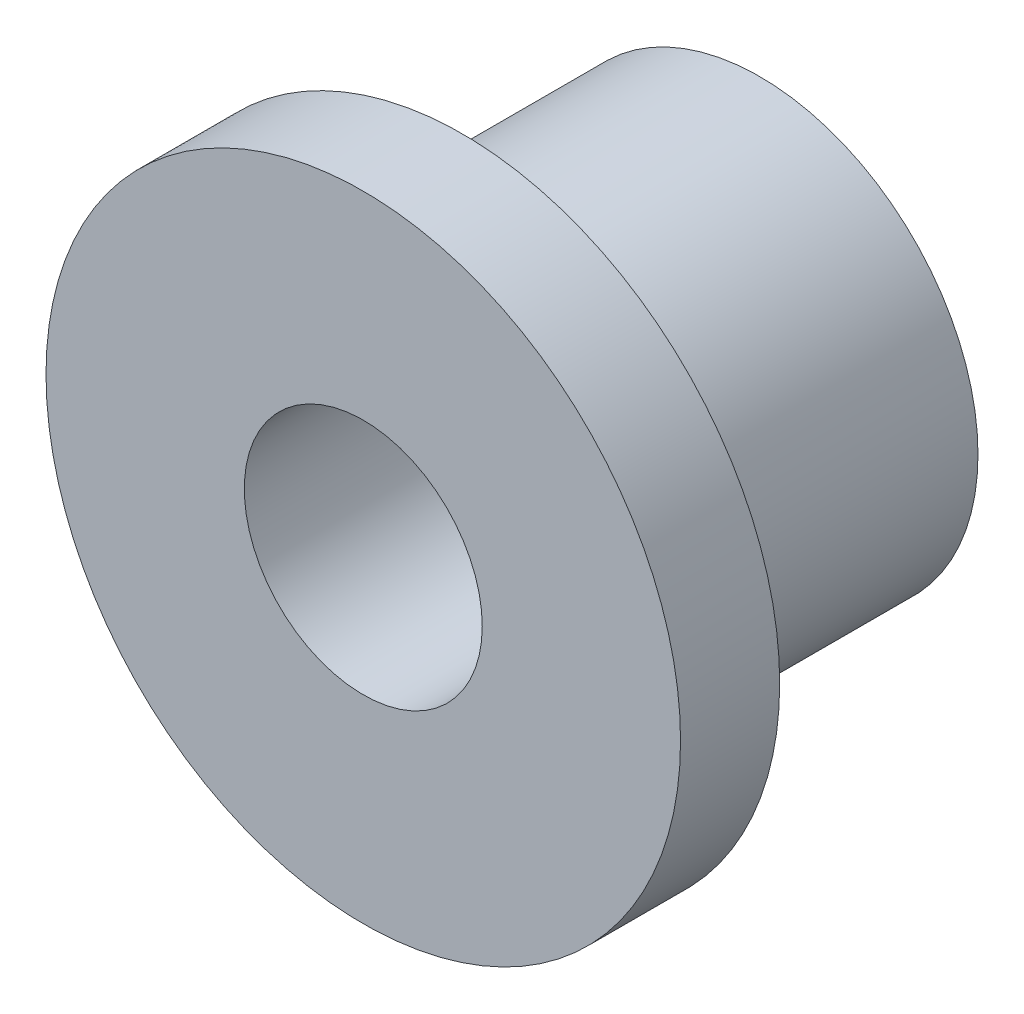
ISO-10303-21;
HEADER;
FILE_DESCRIPTION(('STEP AP214'),'2;1');
FILE_NAME('part.step','',(''),(''),'','','');
FILE_SCHEMA(('AUTOMOTIVE_DESIGN { 1 0 10303 214 1 1 1 1 }'));
ENDSEC;
DATA;
#1=APPLICATION_CONTEXT('core data for automotive mechanical design processes');
#2=APPLICATION_PROTOCOL_DEFINITION('international standard','automotive_design',2000,#1);
#3=PRODUCT_CONTEXT('',#1,'mechanical');
#4=PRODUCT('Part','Part','',(#3));
#5=PRODUCT_RELATED_PRODUCT_CATEGORY('part','',(#4));
#6=PRODUCT_DEFINITION_FORMATION('','',#4);
#7=PRODUCT_DEFINITION_CONTEXT('part definition',#1,'design');
#8=PRODUCT_DEFINITION('design','',#6,#7);
#9=PRODUCT_DEFINITION_SHAPE('','',#8);
#10=(LENGTH_UNIT() NAMED_UNIT(*) SI_UNIT(.MILLI.,.METRE.));
#11=(NAMED_UNIT(*) PLANE_ANGLE_UNIT() SI_UNIT($,.RADIAN.));
#12=(NAMED_UNIT(*) SI_UNIT($,.STERADIAN.) SOLID_ANGLE_UNIT());
#13=UNCERTAINTY_MEASURE_WITH_UNIT(LENGTH_MEASURE(1.E-05),#10,'distance_accuracy_value','');
#14=(GEOMETRIC_REPRESENTATION_CONTEXT(3) GLOBAL_UNCERTAINTY_ASSIGNED_CONTEXT((#13)) GLOBAL_UNIT_ASSIGNED_CONTEXT((#10,
#11,#12)) REPRESENTATION_CONTEXT('',''));
#15=CARTESIAN_POINT('',(0.,0.,0.));
#16=DIRECTION('',(0.,0.,1.));
#17=DIRECTION('',(1.,0.,0.));
#18=AXIS2_PLACEMENT_3D('',#15,#16,#17);
#19=CARTESIAN_POINT('',(0.,0.,48.8859285714286));
#20=DIRECTION('',(0.,0.,1.));
#21=DIRECTION('',(1.,0.,0.));
#22=AXIS2_PLACEMENT_3D('',#19,#20,#21);
#23=CYLINDRICAL_SURFACE('',#22,16.);
#24=CARTESIAN_POINT('',(0.,0.,16.7442142857143));
#25=DIRECTION('',(0.,0.,1.));
#26=DIRECTION('',(1.,0.,0.));
#27=AXIS2_PLACEMENT_3D('',#24,#25,#26);
#28=CIRCLE('',#27,16.);
#29=CARTESIAN_POINT('',(16.,0.,16.7442142857143));
#30=VERTEX_POINT('',#29);
#31=EDGE_CURVE('E10',#30,#30,#28,.T.);
#32=ORIENTED_EDGE('',*,*,#31,.T.);
#33=EDGE_LOOP('',(#32));
#34=FACE_BOUND('',#33,.T.);
#35=CARTESIAN_POINT('',(0.,0.,21.7442142857143));
#36=DIRECTION('',(0.,0.,1.));
#37=DIRECTION('',(1.,0.,0.));
#38=AXIS2_PLACEMENT_3D('',#35,#36,#37);
#39=CIRCLE('',#38,16.);
#40=CARTESIAN_POINT('',(16.,0.,21.7442142857143));
#41=VERTEX_POINT('',#40);
#42=EDGE_CURVE('E54',#41,#41,#39,.T.);
#43=ORIENTED_EDGE('',*,*,#42,.F.);
#44=EDGE_LOOP('',(#43));
#45=FACE_BOUND('',#44,.T.);
#46=ADVANCED_FACE('F32',(#34,#45),#23,.T.);
#47=CARTESIAN_POINT('',(0.,16.,16.7442142857143));
#48=DIRECTION('',(0.,0.,-1.));
#49=DIRECTION('',(-1.,0.,0.));
#50=AXIS2_PLACEMENT_3D('',#47,#48,#49);
#51=PLANE('',#50);
#52=CARTESIAN_POINT('',(0.,0.,16.7442142857143));
#53=DIRECTION('',(0.,0.,1.));
#54=DIRECTION('',(1.,0.,0.));
#55=AXIS2_PLACEMENT_3D('',#52,#53,#54);
#56=CIRCLE('',#55,11.);
#57=CARTESIAN_POINT('',(11.,0.,16.7442142857143));
#58=VERTEX_POINT('',#57);
#59=EDGE_CURVE('E38',#58,#58,#56,.T.);
#60=ORIENTED_EDGE('',*,*,#59,.T.);
#61=EDGE_LOOP('',(#60));
#62=FACE_BOUND('',#61,.T.);
#63=ORIENTED_EDGE('',*,*,#31,.F.);
#64=EDGE_LOOP('',(#63));
#65=FACE_BOUND('',#64,.T.);
#66=ADVANCED_FACE('F62',(#62,#65),#51,.T.);
#67=CARTESIAN_POINT('',(0.,0.,48.8859285714286));
#68=DIRECTION('',(0.,0.,1.));
#69=DIRECTION('',(1.,0.,0.));
#70=AXIS2_PLACEMENT_3D('',#67,#68,#69);
#71=CYLINDRICAL_SURFACE('',#70,11.);
#72=CARTESIAN_POINT('',(0.,0.,1.74421428571429));
#73=DIRECTION('',(0.,0.,1.));
#74=DIRECTION('',(1.,0.,0.));
#75=AXIS2_PLACEMENT_3D('',#72,#73,#74);
#76=CIRCLE('',#75,11.);
#77=CARTESIAN_POINT('',(11.,0.,1.74421428571429));
#78=VERTEX_POINT('',#77);
#79=EDGE_CURVE('E42',#78,#78,#76,.T.);
#80=ORIENTED_EDGE('',*,*,#79,.T.);
#81=EDGE_LOOP('',(#80));
#82=FACE_BOUND('',#81,.T.);
#83=ORIENTED_EDGE('',*,*,#59,.F.);
#84=EDGE_LOOP('',(#83));
#85=FACE_BOUND('',#84,.T.);
#86=ADVANCED_FACE('F66',(#82,#85),#71,.T.);
#87=CARTESIAN_POINT('',(0.,11.,1.7442142857143));
#88=DIRECTION('',(0.,0.,-1.));
#89=DIRECTION('',(-1.,0.,0.));
#90=AXIS2_PLACEMENT_3D('',#87,#88,#89);
#91=PLANE('',#90);
#92=CARTESIAN_POINT('',(0.,0.,1.74421428571429));
#93=DIRECTION('',(0.,0.,1.));
#94=DIRECTION('',(1.,0.,0.));
#95=AXIS2_PLACEMENT_3D('',#92,#93,#94);
#96=CIRCLE('',#95,6.);
#97=CARTESIAN_POINT('',(6.,0.,1.74421428571429));
#98=VERTEX_POINT('',#97);
#99=EDGE_CURVE('E46',#98,#98,#96,.T.);
#100=ORIENTED_EDGE('',*,*,#99,.T.);
#101=EDGE_LOOP('',(#100));
#102=FACE_BOUND('',#101,.T.);
#103=ORIENTED_EDGE('',*,*,#79,.F.);
#104=EDGE_LOOP('',(#103));
#105=FACE_BOUND('',#104,.T.);
#106=ADVANCED_FACE('F70',(#102,#105),#91,.T.);
#107=CARTESIAN_POINT('',(0.,0.,48.8859285714286));
#108=DIRECTION('',(0.,0.,1.));
#109=DIRECTION('',(1.,0.,0.));
#110=AXIS2_PLACEMENT_3D('',#107,#108,#109);
#111=CYLINDRICAL_SURFACE('',#110,6.);
#112=ORIENTED_EDGE('',*,*,#99,.F.);
#113=EDGE_LOOP('',(#112));
#114=FACE_BOUND('',#113,.T.);
#115=CARTESIAN_POINT('',(0.,0.,21.7442142857143));
#116=DIRECTION('',(0.,0.,1.));
#117=DIRECTION('',(1.,0.,0.));
#118=AXIS2_PLACEMENT_3D('',#115,#116,#117);
#119=CIRCLE('',#118,6.);
#120=CARTESIAN_POINT('',(6.,0.,21.7442142857143));
#121=VERTEX_POINT('',#120);
#122=EDGE_CURVE('E51',#121,#121,#119,.T.);
#123=ORIENTED_EDGE('',*,*,#122,.T.);
#124=EDGE_LOOP('',(#123));
#125=FACE_BOUND('',#124,.T.);
#126=ADVANCED_FACE('F77',(#114,#125),#111,.F.);
#127=CARTESIAN_POINT('',(0.,6.,21.7442142857143));
#128=DIRECTION('',(0.,0.,1.));
#129=DIRECTION('',(1.,0.,0.));
#130=AXIS2_PLACEMENT_3D('',#127,#128,#129);
#131=PLANE('',#130);
#132=ORIENTED_EDGE('',*,*,#42,.T.);
#133=EDGE_LOOP('',(#132));
#134=FACE_BOUND('',#133,.T.);
#135=ORIENTED_EDGE('',*,*,#122,.F.);
#136=EDGE_LOOP('',(#135));
#137=FACE_BOUND('',#136,.T.);
#138=ADVANCED_FACE('F58',(#134,#137),#131,.T.);
#139=CLOSED_SHELL('',(#46,#66,#86,#106,#126,#138));
#140=MANIFOLD_SOLID_BREP('B2',#139);
#141=ADVANCED_BREP_SHAPE_REPRESENTATION('',(#18,#140),#14);
#142=SHAPE_DEFINITION_REPRESENTATION(#9,#141);
ENDSEC;
END-ISO-10303-21;
